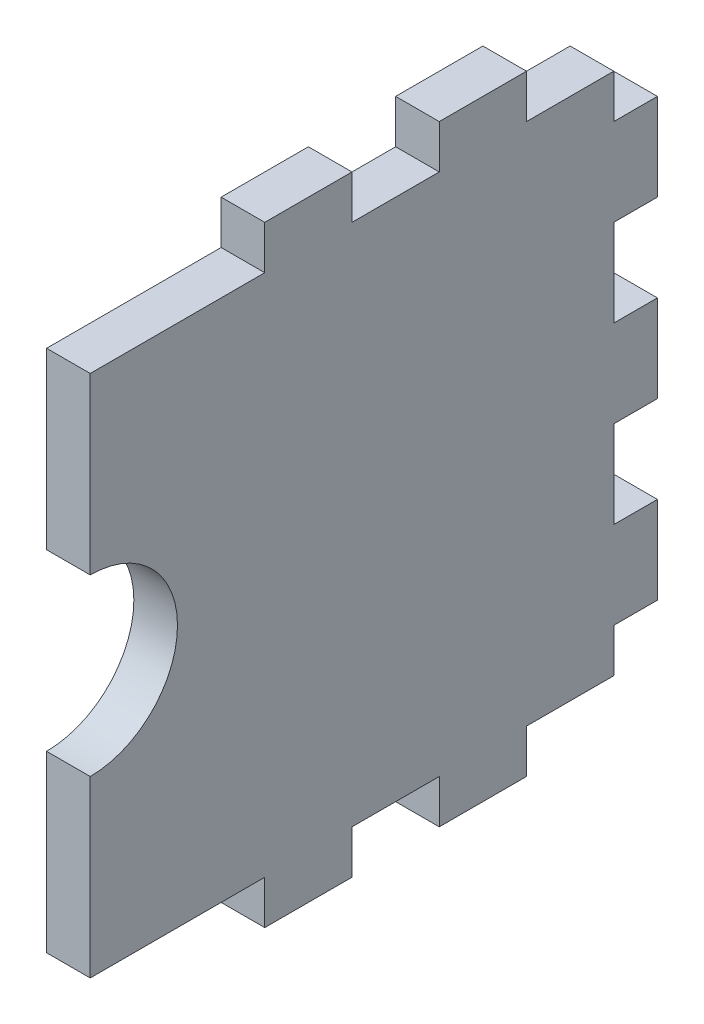
ISO-10303-21;
HEADER;
FILE_DESCRIPTION(('STEP AP214'),'2;1');
FILE_NAME('part.step','',(''),(''),'','','');
FILE_SCHEMA(('AUTOMOTIVE_DESIGN { 1 0 10303 214 1 1 1 1 }'));
ENDSEC;
DATA;
#1=APPLICATION_CONTEXT('core data for automotive mechanical design processes');
#2=APPLICATION_PROTOCOL_DEFINITION('international standard','automotive_design',2000,#1);
#3=PRODUCT_CONTEXT('',#1,'mechanical');
#4=PRODUCT('Part','Part','',(#3));
#5=PRODUCT_RELATED_PRODUCT_CATEGORY('part','',(#4));
#6=PRODUCT_DEFINITION_FORMATION('','',#4);
#7=PRODUCT_DEFINITION_CONTEXT('part definition',#1,'design');
#8=PRODUCT_DEFINITION('design','',#6,#7);
#9=PRODUCT_DEFINITION_SHAPE('','',#8);
#10=(LENGTH_UNIT() NAMED_UNIT(*) SI_UNIT(.MILLI.,.METRE.));
#11=(NAMED_UNIT(*) PLANE_ANGLE_UNIT() SI_UNIT($,.RADIAN.));
#12=(NAMED_UNIT(*) SI_UNIT($,.STERADIAN.) SOLID_ANGLE_UNIT());
#13=UNCERTAINTY_MEASURE_WITH_UNIT(LENGTH_MEASURE(1.E-05),#10,'distance_accuracy_value','');
#14=(GEOMETRIC_REPRESENTATION_CONTEXT(3) GLOBAL_UNCERTAINTY_ASSIGNED_CONTEXT((#13)) GLOBAL_UNIT_ASSIGNED_CONTEXT((#10,
#11,#12)) REPRESENTATION_CONTEXT('',''));
#15=CARTESIAN_POINT('',(0.,0.,0.));
#16=DIRECTION('',(0.,0.,1.));
#17=DIRECTION('',(1.,0.,0.));
#18=AXIS2_PLACEMENT_3D('',#15,#16,#17);
#19=CARTESIAN_POINT('',(6.35,0.,0.));
#20=DIRECTION('',(0.,1.,0.));
#21=DIRECTION('',(0.,0.,1.));
#22=AXIS2_PLACEMENT_3D('',#19,#20,#21);
#23=PLANE('',#22);
#24=DIRECTION('',(0.,0.,-1.));
#25=VECTOR('',#24,1.);
#26=CARTESIAN_POINT('',(0.,0.,0.));
#27=LINE('',#26,#25);
#28=CARTESIAN_POINT('',(0.,0.,57.15));
#29=VERTEX_POINT('',#28);
#30=CARTESIAN_POINT('',(0.,0.,44.45));
#31=VERTEX_POINT('',#30);
#32=EDGE_CURVE('E318',#29,#31,#27,.T.);
#33=ORIENTED_EDGE('',*,*,#32,.T.);
#34=DIRECTION('',(1.,0.,0.));
#35=VECTOR('',#34,1.);
#36=CARTESIAN_POINT('',(0.,0.,44.45));
#37=LINE('',#36,#35);
#38=CARTESIAN_POINT('',(6.35,0.,44.45));
#39=VERTEX_POINT('',#38);
#40=EDGE_CURVE('E388',#31,#39,#37,.T.);
#41=ORIENTED_EDGE('',*,*,#40,.T.);
#42=DIRECTION('',(0.,0.,-1.));
#43=VECTOR('',#42,1.);
#44=CARTESIAN_POINT('',(6.35,0.,0.));
#45=LINE('',#44,#43);
#46=CARTESIAN_POINT('',(6.35,0.,57.15));
#47=VERTEX_POINT('',#46);
#48=EDGE_CURVE('E566',#47,#39,#45,.T.);
#49=ORIENTED_EDGE('',*,*,#48,.F.);
#50=DIRECTION('',(1.,0.,0.));
#51=VECTOR('',#50,1.);
#52=CARTESIAN_POINT('',(0.,0.,57.15));
#53=LINE('',#52,#51);
#54=EDGE_CURVE('E496',#29,#47,#53,.T.);
#55=ORIENTED_EDGE('',*,*,#54,.F.);
#56=EDGE_LOOP('',(#33,#41,#49,#55));
#57=FACE_BOUND('',#56,.T.);
#58=ADVANCED_FACE('F45',(#57),#23,.F.);
#59=CARTESIAN_POINT('',(6.35,0.,0.));
#60=DIRECTION('',(0.,0.,1.));
#61=DIRECTION('',(1.,0.,0.));
#62=AXIS2_PLACEMENT_3D('',#59,#60,#61);
#63=PLANE('',#62);
#64=DIRECTION('',(0.,1.,0.));
#65=VECTOR('',#64,1.);
#66=CARTESIAN_POINT('',(0.,0.,0.));
#67=LINE('',#66,#65);
#68=CARTESIAN_POINT('',(0.,38.1,0.));
#69=VERTEX_POINT('',#68);
#70=CARTESIAN_POINT('',(0.,50.8,0.));
#71=VERTEX_POINT('',#70);
#72=EDGE_CURVE('E324',#69,#71,#67,.T.);
#73=ORIENTED_EDGE('',*,*,#72,.T.);
#74=DIRECTION('',(1.,0.,0.));
#75=VECTOR('',#74,1.);
#76=CARTESIAN_POINT('',(0.,50.8,0.));
#77=LINE('',#76,#75);
#78=CARTESIAN_POINT('',(6.35,50.8,0.));
#79=VERTEX_POINT('',#78);
#80=EDGE_CURVE('E458',#71,#79,#77,.T.);
#81=ORIENTED_EDGE('',*,*,#80,.T.);
#82=DIRECTION('',(0.,1.,0.));
#83=VECTOR('',#82,1.);
#84=CARTESIAN_POINT('',(6.35,0.,0.));
#85=LINE('',#84,#83);
#86=CARTESIAN_POINT('',(6.35,38.1,0.));
#87=VERTEX_POINT('',#86);
#88=EDGE_CURVE('E306',#87,#79,#85,.T.);
#89=ORIENTED_EDGE('',*,*,#88,.F.);
#90=DIRECTION('',(1.,0.,0.));
#91=VECTOR('',#90,1.);
#92=CARTESIAN_POINT('',(0.,38.1,0.));
#93=LINE('',#92,#91);
#94=EDGE_CURVE('E593',#69,#87,#93,.T.);
#95=ORIENTED_EDGE('',*,*,#94,.F.);
#96=EDGE_LOOP('',(#73,#81,#89,#95));
#97=FACE_BOUND('',#96,.T.);
#98=ADVANCED_FACE('F592',(#97),#63,.F.);
#99=CARTESIAN_POINT('',(6.35,12.7,0.));
#100=VERTEX_POINT('',#99);
#101=CARTESIAN_POINT('',(6.35,25.4,0.));
#102=VERTEX_POINT('',#101);
#103=EDGE_CURVE('E299',#100,#102,#85,.T.);
#104=ORIENTED_EDGE('',*,*,#103,.F.);
#105=DIRECTION('',(1.,0.,0.));
#106=VECTOR('',#105,1.);
#107=CARTESIAN_POINT('',(0.,12.7,0.));
#108=LINE('',#107,#106);
#109=CARTESIAN_POINT('',(0.,12.7,0.));
#110=VERTEX_POINT('',#109);
#111=EDGE_CURVE('E414',#110,#100,#108,.T.);
#112=ORIENTED_EDGE('',*,*,#111,.F.);
#113=CARTESIAN_POINT('',(0.,25.4,0.));
#114=VERTEX_POINT('',#113);
#115=EDGE_CURVE('E325',#110,#114,#67,.T.);
#116=ORIENTED_EDGE('',*,*,#115,.T.);
#117=DIRECTION('',(1.,0.,0.));
#118=VECTOR('',#117,1.);
#119=CARTESIAN_POINT('',(0.,25.4,0.));
#120=LINE('',#119,#118);
#121=EDGE_CURVE('E669',#114,#102,#120,.T.);
#122=ORIENTED_EDGE('',*,*,#121,.T.);
#123=EDGE_LOOP('',(#104,#112,#116,#122));
#124=FACE_BOUND('',#123,.T.);
#125=ADVANCED_FACE('F636',(#124),#63,.F.);
#126=CARTESIAN_POINT('',(6.35,88.9,0.));
#127=DIRECTION('',(0.,-1.,0.));
#128=DIRECTION('',(0.,0.,-1.));
#129=AXIS2_PLACEMENT_3D('',#126,#127,#128);
#130=PLANE('',#129);
#131=DIRECTION('',(0.,0.,1.));
#132=VECTOR('',#131,1.);
#133=CARTESIAN_POINT('',(0.,88.9,0.));
#134=LINE('',#133,#132);
#135=CARTESIAN_POINT('',(0.,88.9,44.45));
#136=VERTEX_POINT('',#135);
#137=CARTESIAN_POINT('',(0.,88.9,57.15));
#138=VERTEX_POINT('',#137);
#139=EDGE_CURVE('E287',#136,#138,#134,.T.);
#140=ORIENTED_EDGE('',*,*,#139,.T.);
#141=DIRECTION('',(1.,0.,0.));
#142=VECTOR('',#141,1.);
#143=CARTESIAN_POINT('',(0.,88.9,57.15));
#144=LINE('',#143,#142);
#145=CARTESIAN_POINT('',(6.35,88.9,57.15));
#146=VERTEX_POINT('',#145);
#147=EDGE_CURVE('E268',#138,#146,#144,.T.);
#148=ORIENTED_EDGE('',*,*,#147,.T.);
#149=DIRECTION('',(0.,0.,1.));
#150=VECTOR('',#149,1.);
#151=CARTESIAN_POINT('',(6.35,88.9,0.));
#152=LINE('',#151,#150);
#153=CARTESIAN_POINT('',(6.35,88.9,44.45));
#154=VERTEX_POINT('',#153);
#155=EDGE_CURVE('E285',#154,#146,#152,.T.);
#156=ORIENTED_EDGE('',*,*,#155,.F.);
#157=DIRECTION('',(1.,0.,0.));
#158=VECTOR('',#157,1.);
#159=CARTESIAN_POINT('',(0.,88.9,44.45));
#160=LINE('',#159,#158);
#161=EDGE_CURVE('E710',#136,#154,#160,.T.);
#162=ORIENTED_EDGE('',*,*,#161,.F.);
#163=EDGE_LOOP('',(#140,#148,#156,#162));
#164=FACE_BOUND('',#163,.T.);
#165=ADVANCED_FACE('F283',(#164),#130,.F.);
#166=CARTESIAN_POINT('',(6.35,0.,82.55));
#167=DIRECTION('',(0.,0.,-1.));
#168=DIRECTION('',(-1.,0.,0.));
#169=AXIS2_PLACEMENT_3D('',#166,#167,#168);
#170=PLANE('',#169);
#171=DIRECTION('',(0.,-1.,0.));
#172=VECTOR('',#171,1.);
#173=CARTESIAN_POINT('',(6.35,0.,82.55));
#174=LINE('',#173,#172);
#175=CARTESIAN_POINT('',(6.35,82.55,82.55));
#176=VERTEX_POINT('',#175);
#177=CARTESIAN_POINT('',(6.35,57.15,82.55));
#178=VERTEX_POINT('',#177);
#179=EDGE_CURVE('E54',#176,#178,#174,.T.);
#180=ORIENTED_EDGE('',*,*,#179,.F.);
#181=DIRECTION('',(1.,0.,0.));
#182=VECTOR('',#181,1.);
#183=CARTESIAN_POINT('',(0.,82.55,82.55));
#184=LINE('',#183,#182);
#185=CARTESIAN_POINT('',(0.,82.55,82.55));
#186=VERTEX_POINT('',#185);
#187=EDGE_CURVE('E728',#186,#176,#184,.T.);
#188=ORIENTED_EDGE('',*,*,#187,.F.);
#189=DIRECTION('',(0.,-1.,0.));
#190=VECTOR('',#189,1.);
#191=CARTESIAN_POINT('',(0.,0.,82.55));
#192=LINE('',#191,#190);
#193=CARTESIAN_POINT('',(0.,57.15,82.55));
#194=VERTEX_POINT('',#193);
#195=EDGE_CURVE('E331',#186,#194,#192,.T.);
#196=ORIENTED_EDGE('',*,*,#195,.T.);
#197=DIRECTION('',(1.,0.,0.));
#198=VECTOR('',#197,1.);
#199=CARTESIAN_POINT('',(0.,57.15,82.55));
#200=LINE('',#199,#198);
#201=EDGE_CURVE('E319',#194,#178,#200,.T.);
#202=ORIENTED_EDGE('',*,*,#201,.T.);
#203=EDGE_LOOP('',(#180,#188,#196,#202));
#204=FACE_BOUND('',#203,.T.);
#205=ADVANCED_FACE('F639',(#204),#170,.F.);
#206=CARTESIAN_POINT('',(0.,0.,31.75));
#207=VERTEX_POINT('',#206);
#208=CARTESIAN_POINT('',(0.,0.,19.05));
#209=VERTEX_POINT('',#208);
#210=EDGE_CURVE('E314',#207,#209,#27,.T.);
#211=ORIENTED_EDGE('',*,*,#210,.T.);
#212=DIRECTION('',(1.,0.,0.));
#213=VECTOR('',#212,1.);
#214=CARTESIAN_POINT('',(0.,0.,19.05));
#215=LINE('',#214,#213);
#216=CARTESIAN_POINT('',(6.35,0.,19.05));
#217=VERTEX_POINT('',#216);
#218=EDGE_CURVE('E427',#209,#217,#215,.T.);
#219=ORIENTED_EDGE('',*,*,#218,.T.);
#220=CARTESIAN_POINT('',(6.35,0.,31.75));
#221=VERTEX_POINT('',#220);
#222=EDGE_CURVE('E339',#221,#217,#45,.T.);
#223=ORIENTED_EDGE('',*,*,#222,.F.);
#224=DIRECTION('',(1.,0.,0.));
#225=VECTOR('',#224,1.);
#226=CARTESIAN_POINT('',(0.,0.,31.75));
#227=LINE('',#226,#225);
#228=EDGE_CURVE('E378',#207,#221,#227,.T.);
#229=ORIENTED_EDGE('',*,*,#228,.F.);
#230=EDGE_LOOP('',(#211,#219,#223,#229));
#231=FACE_BOUND('',#230,.T.);
#232=ADVANCED_FACE('F47',(#231),#23,.F.);
#233=CARTESIAN_POINT('',(6.35,63.5,0.));
#234=VERTEX_POINT('',#233);
#235=CARTESIAN_POINT('',(6.35,76.2,0.));
#236=VERTEX_POINT('',#235);
#237=EDGE_CURVE('E308',#234,#236,#85,.T.);
#238=ORIENTED_EDGE('',*,*,#237,.F.);
#239=DIRECTION('',(1.,0.,0.));
#240=VECTOR('',#239,1.);
#241=CARTESIAN_POINT('',(0.,63.5,0.));
#242=LINE('',#241,#240);
#243=CARTESIAN_POINT('',(0.,63.5,0.));
#244=VERTEX_POINT('',#243);
#245=EDGE_CURVE('E463',#244,#234,#242,.T.);
#246=ORIENTED_EDGE('',*,*,#245,.F.);
#247=CARTESIAN_POINT('',(0.,76.2,0.));
#248=VERTEX_POINT('',#247);
#249=EDGE_CURVE('E320',#244,#248,#67,.T.);
#250=ORIENTED_EDGE('',*,*,#249,.T.);
#251=DIRECTION('',(1.,0.,0.));
#252=VECTOR('',#251,1.);
#253=CARTESIAN_POINT('',(0.,76.2,0.));
#254=LINE('',#253,#252);
#255=EDGE_CURVE('E552',#248,#236,#254,.T.);
#256=ORIENTED_EDGE('',*,*,#255,.T.);
#257=EDGE_LOOP('',(#238,#246,#250,#256));
#258=FACE_BOUND('',#257,.T.);
#259=ADVANCED_FACE('F607',(#258),#63,.F.);
#260=CARTESIAN_POINT('',(0.,88.9,19.05));
#261=VERTEX_POINT('',#260);
#262=CARTESIAN_POINT('',(0.,88.9,31.75));
#263=VERTEX_POINT('',#262);
#264=EDGE_CURVE('E327',#261,#263,#134,.T.);
#265=ORIENTED_EDGE('',*,*,#264,.T.);
#266=DIRECTION('',(1.,0.,0.));
#267=VECTOR('',#266,1.);
#268=CARTESIAN_POINT('',(0.,88.9,31.75));
#269=LINE('',#268,#267);
#270=CARTESIAN_POINT('',(6.35,88.9,31.75));
#271=VERTEX_POINT('',#270);
#272=EDGE_CURVE('E347',#263,#271,#269,.T.);
#273=ORIENTED_EDGE('',*,*,#272,.T.);
#274=CARTESIAN_POINT('',(6.35,88.9,19.05));
#275=VERTEX_POINT('',#274);
#276=EDGE_CURVE('E298',#275,#271,#152,.T.);
#277=ORIENTED_EDGE('',*,*,#276,.F.);
#278=DIRECTION('',(1.,0.,0.));
#279=VECTOR('',#278,1.);
#280=CARTESIAN_POINT('',(0.,88.9,19.05));
#281=LINE('',#280,#279);
#282=EDGE_CURVE('E348',#261,#275,#281,.T.);
#283=ORIENTED_EDGE('',*,*,#282,.F.);
#284=EDGE_LOOP('',(#265,#273,#277,#283));
#285=FACE_BOUND('',#284,.T.);
#286=ADVANCED_FACE('F345',(#285),#130,.F.);
#287=CARTESIAN_POINT('',(0.,31.75,82.55));
#288=VERTEX_POINT('',#287);
#289=CARTESIAN_POINT('',(0.,6.35,82.55));
#290=VERTEX_POINT('',#289);
#291=EDGE_CURVE('E328',#288,#290,#192,.T.);
#292=ORIENTED_EDGE('',*,*,#291,.T.);
#293=DIRECTION('',(1.,0.,0.));
#294=VECTOR('',#293,1.);
#295=CARTESIAN_POINT('',(0.,6.35,82.55));
#296=LINE('',#295,#294);
#297=CARTESIAN_POINT('',(6.35,6.35,82.55));
#298=VERTEX_POINT('',#297);
#299=EDGE_CURVE('E405',#290,#298,#296,.T.);
#300=ORIENTED_EDGE('',*,*,#299,.T.);
#301=CARTESIAN_POINT('',(6.35,31.75,82.55));
#302=VERTEX_POINT('',#301);
#303=EDGE_CURVE('E304',#302,#298,#174,.T.);
#304=ORIENTED_EDGE('',*,*,#303,.F.);
#305=DIRECTION('',(1.,0.,0.));
#306=VECTOR('',#305,1.);
#307=CARTESIAN_POINT('',(0.,31.75,82.55));
#308=LINE('',#307,#306);
#309=EDGE_CURVE('E549',#302,#288,#308,.F.);
#310=ORIENTED_EDGE('',*,*,#309,.T.);
#311=EDGE_LOOP('',(#292,#300,#304,#310));
#312=FACE_BOUND('',#311,.T.);
#313=ADVANCED_FACE('F647',(#312),#170,.F.);
#314=CARTESIAN_POINT('',(6.35,0.,0.));
#315=DIRECTION('',(-1.,0.,0.));
#316=DIRECTION('',(0.,0.,1.));
#317=AXIS2_PLACEMENT_3D('',#314,#315,#316);
#318=PLANE('',#317);
#319=ORIENTED_EDGE('',*,*,#222,.T.);
#320=DIRECTION('',(0.,-1.,0.));
#321=VECTOR('',#320,1.);
#322=CARTESIAN_POINT('',(6.35,6.35,19.05));
#323=LINE('',#322,#321);
#324=CARTESIAN_POINT('',(6.35,6.35,19.05));
#325=VERTEX_POINT('',#324);
#326=EDGE_CURVE('E432',#325,#217,#323,.T.);
#327=ORIENTED_EDGE('',*,*,#326,.F.);
#328=DIRECTION('',(0.,0.,1.));
#329=VECTOR('',#328,1.);
#330=CARTESIAN_POINT('',(6.35,6.35,6.35));
#331=LINE('',#330,#329);
#332=CARTESIAN_POINT('',(6.35,6.35,6.35));
#333=VERTEX_POINT('',#332);
#334=EDGE_CURVE('E435',#333,#325,#331,.T.);
#335=ORIENTED_EDGE('',*,*,#334,.F.);
#336=DIRECTION('',(0.,-1.,0.));
#337=VECTOR('',#336,1.);
#338=CARTESIAN_POINT('',(6.35,6.35,6.35));
#339=LINE('',#338,#337);
#340=CARTESIAN_POINT('',(6.35,12.7,6.35));
#341=VERTEX_POINT('',#340);
#342=EDGE_CURVE('E440',#341,#333,#339,.T.);
#343=ORIENTED_EDGE('',*,*,#342,.F.);
#344=DIRECTION('',(0.,0.,1.));
#345=VECTOR('',#344,1.);
#346=CARTESIAN_POINT('',(6.35,12.7,0.));
#347=LINE('',#346,#345);
#348=EDGE_CURVE('E392',#100,#341,#347,.T.);
#349=ORIENTED_EDGE('',*,*,#348,.F.);
#350=ORIENTED_EDGE('',*,*,#103,.T.);
#351=DIRECTION('',(0.,0.,-1.));
#352=VECTOR('',#351,1.);
#353=CARTESIAN_POINT('',(6.35,25.4,0.));
#354=LINE('',#353,#352);
#355=CARTESIAN_POINT('',(6.35,25.4,6.35));
#356=VERTEX_POINT('',#355);
#357=EDGE_CURVE('E289',#356,#102,#354,.T.);
#358=ORIENTED_EDGE('',*,*,#357,.F.);
#359=DIRECTION('',(0.,-1.,0.));
#360=VECTOR('',#359,1.);
#361=CARTESIAN_POINT('',(6.35,25.4,6.35));
#362=LINE('',#361,#360);
#363=CARTESIAN_POINT('',(6.35,38.1,6.35));
#364=VERTEX_POINT('',#363);
#365=EDGE_CURVE('E691',#364,#356,#362,.T.);
#366=ORIENTED_EDGE('',*,*,#365,.F.);
#367=DIRECTION('',(0.,0.,1.));
#368=VECTOR('',#367,1.);
#369=CARTESIAN_POINT('',(6.35,38.1,0.));
#370=LINE('',#369,#368);
#371=EDGE_CURVE('E588',#87,#364,#370,.T.);
#372=ORIENTED_EDGE('',*,*,#371,.F.);
#373=ORIENTED_EDGE('',*,*,#88,.T.);
#374=DIRECTION('',(0.,0.,-1.));
#375=VECTOR('',#374,1.);
#376=CARTESIAN_POINT('',(6.35,50.8,0.));
#377=LINE('',#376,#375);
#378=CARTESIAN_POINT('',(6.35,50.8,6.35));
#379=VERTEX_POINT('',#378);
#380=EDGE_CURVE('E482',#379,#79,#377,.T.);
#381=ORIENTED_EDGE('',*,*,#380,.F.);
#382=DIRECTION('',(0.,-1.,0.));
#383=VECTOR('',#382,1.);
#384=CARTESIAN_POINT('',(6.35,50.8,6.35));
#385=LINE('',#384,#383);
#386=CARTESIAN_POINT('',(6.35,63.5,6.35));
#387=VERTEX_POINT('',#386);
#388=EDGE_CURVE('E473',#387,#379,#385,.T.);
#389=ORIENTED_EDGE('',*,*,#388,.F.);
#390=DIRECTION('',(0.,0.,1.));
#391=VECTOR('',#390,1.);
#392=CARTESIAN_POINT('',(6.35,63.5,0.));
#393=LINE('',#392,#391);
#394=EDGE_CURVE('E477',#234,#387,#393,.T.);
#395=ORIENTED_EDGE('',*,*,#394,.F.);
#396=ORIENTED_EDGE('',*,*,#237,.T.);
#397=DIRECTION('',(0.,0.,-1.));
#398=VECTOR('',#397,1.);
#399=CARTESIAN_POINT('',(6.35,76.2,0.));
#400=LINE('',#399,#398);
#401=CARTESIAN_POINT('',(6.35,76.2,6.35000000000001));
#402=VERTEX_POINT('',#401);
#403=EDGE_CURVE('E540',#402,#236,#400,.T.);
#404=ORIENTED_EDGE('',*,*,#403,.F.);
#405=DIRECTION('',(0.,-1.,0.));
#406=VECTOR('',#405,1.);
#407=CARTESIAN_POINT('',(6.35,76.2,6.35000000000001));
#408=LINE('',#407,#406);
#409=CARTESIAN_POINT('',(6.35,82.55,6.35000000000001));
#410=VERTEX_POINT('',#409);
#411=EDGE_CURVE('E536',#410,#402,#408,.T.);
#412=ORIENTED_EDGE('',*,*,#411,.F.);
#413=DIRECTION('',(0.,0.,-1.));
#414=VECTOR('',#413,1.);
#415=CARTESIAN_POINT('',(6.35,82.55,6.35000000000001));
#416=LINE('',#415,#414);
#417=CARTESIAN_POINT('',(6.35,82.55,19.05));
#418=VERTEX_POINT('',#417);
#419=EDGE_CURVE('E485',#418,#410,#416,.T.);
#420=ORIENTED_EDGE('',*,*,#419,.F.);
#421=DIRECTION('',(0.,-1.,0.));
#422=VECTOR('',#421,1.);
#423=CARTESIAN_POINT('',(6.35,88.9,19.05));
#424=LINE('',#423,#422);
#425=EDGE_CURVE('E522',#275,#418,#424,.T.);
#426=ORIENTED_EDGE('',*,*,#425,.F.);
#427=ORIENTED_EDGE('',*,*,#276,.T.);
#428=DIRECTION('',(0.,1.,0.));
#429=VECTOR('',#428,1.);
#430=CARTESIAN_POINT('',(6.35,88.9,31.75));
#431=LINE('',#430,#429);
#432=CARTESIAN_POINT('',(6.35,82.55,31.75));
#433=VERTEX_POINT('',#432);
#434=EDGE_CURVE('E377',#433,#271,#431,.T.);
#435=ORIENTED_EDGE('',*,*,#434,.F.);
#436=DIRECTION('',(0.,0.,-1.));
#437=VECTOR('',#436,1.);
#438=CARTESIAN_POINT('',(6.35,82.55,44.45));
#439=LINE('',#438,#437);
#440=CARTESIAN_POINT('',(6.35,82.55,44.45));
#441=VERTEX_POINT('',#440);
#442=EDGE_CURVE('E714',#441,#433,#439,.T.);
#443=ORIENTED_EDGE('',*,*,#442,.F.);
#444=DIRECTION('',(0.,-1.,0.));
#445=VECTOR('',#444,1.);
#446=CARTESIAN_POINT('',(6.35,88.9,44.45));
#447=LINE('',#446,#445);
#448=EDGE_CURVE('E296',#154,#441,#447,.T.);
#449=ORIENTED_EDGE('',*,*,#448,.F.);
#450=ORIENTED_EDGE('',*,*,#155,.T.);
#451=DIRECTION('',(0.,1.,0.));
#452=VECTOR('',#451,1.);
#453=CARTESIAN_POINT('',(6.35,88.9,57.15));
#454=LINE('',#453,#452);
#455=CARTESIAN_POINT('',(6.35,82.55,57.15));
#456=VERTEX_POINT('',#455);
#457=EDGE_CURVE('E265',#456,#146,#454,.T.);
#458=ORIENTED_EDGE('',*,*,#457,.F.);
#459=DIRECTION('',(0.,0.,-1.));
#460=VECTOR('',#459,1.);
#461=CARTESIAN_POINT('',(6.35,82.55,82.55));
#462=LINE('',#461,#460);
#463=EDGE_CURVE('E277',#176,#456,#462,.T.);
#464=ORIENTED_EDGE('',*,*,#463,.F.);
#465=ORIENTED_EDGE('',*,*,#179,.T.);
#466=CARTESIAN_POINT('',(6.35,44.45,82.55));
#467=DIRECTION('',(1.,0.,0.));
#468=DIRECTION('',(0.,0.,-1.));
#469=AXIS2_PLACEMENT_3D('',#466,#467,#468);
#470=CIRCLE('',#469,12.7);
#471=EDGE_CURVE('E431',#302,#178,#470,.T.);
#472=ORIENTED_EDGE('',*,*,#471,.F.);
#473=ORIENTED_EDGE('',*,*,#303,.T.);
#474=DIRECTION('',(0.,0.,1.));
#475=VECTOR('',#474,1.);
#476=CARTESIAN_POINT('',(6.35,6.35,82.55));
#477=LINE('',#476,#475);
#478=CARTESIAN_POINT('',(6.35,6.35,57.15));
#479=VERTEX_POINT('',#478);
#480=EDGE_CURVE('E505',#479,#298,#477,.T.);
#481=ORIENTED_EDGE('',*,*,#480,.F.);
#482=DIRECTION('',(0.,1.,0.));
#483=VECTOR('',#482,1.);
#484=CARTESIAN_POINT('',(6.35,0.,57.15));
#485=LINE('',#484,#483);
#486=EDGE_CURVE('E472',#47,#479,#485,.T.);
#487=ORIENTED_EDGE('',*,*,#486,.F.);
#488=ORIENTED_EDGE('',*,*,#48,.T.);
#489=DIRECTION('',(0.,-1.,0.));
#490=VECTOR('',#489,1.);
#491=CARTESIAN_POINT('',(6.35,0.,44.45));
#492=LINE('',#491,#490);
#493=CARTESIAN_POINT('',(6.35,6.35,44.45));
#494=VERTEX_POINT('',#493);
#495=EDGE_CURVE('E393',#494,#39,#492,.T.);
#496=ORIENTED_EDGE('',*,*,#495,.F.);
#497=DIRECTION('',(0.,0.,1.));
#498=VECTOR('',#497,1.);
#499=CARTESIAN_POINT('',(6.35,6.35,44.45));
#500=LINE('',#499,#498);
#501=CARTESIAN_POINT('',(6.35,6.35,31.75));
#502=VERTEX_POINT('',#501);
#503=EDGE_CURVE('E396',#502,#494,#500,.T.);
#504=ORIENTED_EDGE('',*,*,#503,.F.);
#505=DIRECTION('',(0.,1.,0.));
#506=VECTOR('',#505,1.);
#507=CARTESIAN_POINT('',(6.35,0.,31.75));
#508=LINE('',#507,#506);
#509=EDGE_CURVE('E401',#221,#502,#508,.T.);
#510=ORIENTED_EDGE('',*,*,#509,.F.);
#511=EDGE_LOOP('',(#319,#327,#335,#343,#349,#350,#358,#366,#372,#373,#381,#389,#395,#396,#404,
#412,#420,#426,#427,#435,#443,#449,#450,#458,#464,#465,#472,#473,#481,#487,#488,#496,#504,#510));
#512=FACE_BOUND('',#511,.T.);
#513=ADVANCED_FACE('F293',(#512),#318,.F.);
#514=CARTESIAN_POINT('',(0.,0.,0.));
#515=DIRECTION('',(-1.,0.,0.));
#516=DIRECTION('',(0.,0.,1.));
#517=AXIS2_PLACEMENT_3D('',#514,#515,#516);
#518=PLANE('',#517);
#519=DIRECTION('',(0.,-1.,0.));
#520=VECTOR('',#519,1.);
#521=CARTESIAN_POINT('',(0.,6.35,19.05));
#522=LINE('',#521,#520);
#523=CARTESIAN_POINT('',(0.,6.35,19.05));
#524=VERTEX_POINT('',#523);
#525=EDGE_CURVE('E417',#524,#209,#522,.T.);
#526=ORIENTED_EDGE('',*,*,#525,.T.);
#527=ORIENTED_EDGE('',*,*,#210,.F.);
#528=DIRECTION('',(0.,1.,0.));
#529=VECTOR('',#528,1.);
#530=CARTESIAN_POINT('',(0.,0.,31.75));
#531=LINE('',#530,#529);
#532=CARTESIAN_POINT('',(0.,6.35,31.75));
#533=VERTEX_POINT('',#532);
#534=EDGE_CURVE('E397',#207,#533,#531,.T.);
#535=ORIENTED_EDGE('',*,*,#534,.T.);
#536=DIRECTION('',(0.,0.,1.));
#537=VECTOR('',#536,1.);
#538=CARTESIAN_POINT('',(0.,6.35,44.45));
#539=LINE('',#538,#537);
#540=CARTESIAN_POINT('',(0.,6.35,44.45));
#541=VERTEX_POINT('',#540);
#542=EDGE_CURVE('E69',#533,#541,#539,.T.);
#543=ORIENTED_EDGE('',*,*,#542,.T.);
#544=DIRECTION('',(0.,-1.,0.));
#545=VECTOR('',#544,1.);
#546=CARTESIAN_POINT('',(0.,0.,44.45));
#547=LINE('',#546,#545);
#548=EDGE_CURVE('E381',#541,#31,#547,.T.);
#549=ORIENTED_EDGE('',*,*,#548,.T.);
#550=ORIENTED_EDGE('',*,*,#32,.F.);
#551=DIRECTION('',(0.,1.,0.));
#552=VECTOR('',#551,1.);
#553=CARTESIAN_POINT('',(0.,0.,57.15));
#554=LINE('',#553,#552);
#555=CARTESIAN_POINT('',(0.,6.35,57.15));
#556=VERTEX_POINT('',#555);
#557=EDGE_CURVE('E508',#29,#556,#554,.T.);
#558=ORIENTED_EDGE('',*,*,#557,.T.);
#559=DIRECTION('',(0.,0.,1.));
#560=VECTOR('',#559,1.);
#561=CARTESIAN_POINT('',(0.,6.35,82.55));
#562=LINE('',#561,#560);
#563=EDGE_CURVE('E499',#556,#290,#562,.T.);
#564=ORIENTED_EDGE('',*,*,#563,.T.);
#565=ORIENTED_EDGE('',*,*,#291,.F.);
#566=CARTESIAN_POINT('',(0.,44.45,82.55));
#567=DIRECTION('',(-1.,0.,0.));
#568=DIRECTION('',(0.,0.,1.));
#569=AXIS2_PLACEMENT_3D('',#566,#567,#568);
#570=CIRCLE('',#569,12.7);
#571=EDGE_CURVE('E11',#194,#288,#570,.T.);
#572=ORIENTED_EDGE('',*,*,#571,.F.);
#573=ORIENTED_EDGE('',*,*,#195,.F.);
#574=DIRECTION('',(0.,0.,-1.));
#575=VECTOR('',#574,1.);
#576=CARTESIAN_POINT('',(0.,82.55,82.55));
#577=LINE('',#576,#575);
#578=CARTESIAN_POINT('',(0.,82.55,57.15));
#579=VERTEX_POINT('',#578);
#580=EDGE_CURVE('E278',#186,#579,#577,.T.);
#581=ORIENTED_EDGE('',*,*,#580,.T.);
#582=DIRECTION('',(0.,1.,0.));
#583=VECTOR('',#582,1.);
#584=CARTESIAN_POINT('',(0.,88.9,57.15));
#585=LINE('',#584,#583);
#586=EDGE_CURVE('E725',#579,#138,#585,.T.);
#587=ORIENTED_EDGE('',*,*,#586,.T.);
#588=ORIENTED_EDGE('',*,*,#139,.F.);
#589=DIRECTION('',(0.,-1.,0.));
#590=VECTOR('',#589,1.);
#591=CARTESIAN_POINT('',(0.,88.9,44.45));
#592=LINE('',#591,#590);
#593=CARTESIAN_POINT('',(0.,82.55,44.45));
#594=VERTEX_POINT('',#593);
#595=EDGE_CURVE('E368',#136,#594,#592,.T.);
#596=ORIENTED_EDGE('',*,*,#595,.T.);
#597=DIRECTION('',(0.,0.,-1.));
#598=VECTOR('',#597,1.);
#599=CARTESIAN_POINT('',(0.,82.55,44.45));
#600=LINE('',#599,#598);
#601=CARTESIAN_POINT('',(0.,82.55,31.75));
#602=VERTEX_POINT('',#601);
#603=EDGE_CURVE('E360',#594,#602,#600,.T.);
#604=ORIENTED_EDGE('',*,*,#603,.T.);
#605=DIRECTION('',(0.,1.,0.));
#606=VECTOR('',#605,1.);
#607=CARTESIAN_POINT('',(0.,88.9,31.75));
#608=LINE('',#607,#606);
#609=EDGE_CURVE('E357',#602,#263,#608,.T.);
#610=ORIENTED_EDGE('',*,*,#609,.T.);
#611=ORIENTED_EDGE('',*,*,#264,.F.);
#612=DIRECTION('',(0.,-1.,0.));
#613=VECTOR('',#612,1.);
#614=CARTESIAN_POINT('',(0.,88.9,19.05));
#615=LINE('',#614,#613);
#616=CARTESIAN_POINT('',(0.,82.55,19.05));
#617=VERTEX_POINT('',#616);
#618=EDGE_CURVE('E355',#261,#617,#615,.T.);
#619=ORIENTED_EDGE('',*,*,#618,.T.);
#620=DIRECTION('',(0.,0.,-1.));
#621=VECTOR('',#620,1.);
#622=CARTESIAN_POINT('',(0.,82.55,6.35000000000001));
#623=LINE('',#622,#621);
#624=CARTESIAN_POINT('',(0.,82.55,6.35000000000001));
#625=VERTEX_POINT('',#624);
#626=EDGE_CURVE('E518',#617,#625,#623,.T.);
#627=ORIENTED_EDGE('',*,*,#626,.T.);
#628=DIRECTION('',(0.,-1.,0.));
#629=VECTOR('',#628,1.);
#630=CARTESIAN_POINT('',(0.,76.2,6.35000000000001));
#631=LINE('',#630,#629);
#632=CARTESIAN_POINT('',(0.,76.2,6.35000000000001));
#633=VERTEX_POINT('',#632);
#634=EDGE_CURVE('E521',#625,#633,#631,.T.);
#635=ORIENTED_EDGE('',*,*,#634,.T.);
#636=DIRECTION('',(0.,0.,-1.));
#637=VECTOR('',#636,1.);
#638=CARTESIAN_POINT('',(0.,76.2,0.));
#639=LINE('',#638,#637);
#640=EDGE_CURVE('E526',#633,#248,#639,.T.);
#641=ORIENTED_EDGE('',*,*,#640,.T.);
#642=ORIENTED_EDGE('',*,*,#249,.F.);
#643=DIRECTION('',(0.,0.,1.));
#644=VECTOR('',#643,1.);
#645=CARTESIAN_POINT('',(0.,63.5,0.));
#646=LINE('',#645,#644);
#647=CARTESIAN_POINT('',(0.,63.5,6.35));
#648=VERTEX_POINT('',#647);
#649=EDGE_CURVE('E489',#244,#648,#646,.T.);
#650=ORIENTED_EDGE('',*,*,#649,.T.);
#651=DIRECTION('',(0.,-1.,0.));
#652=VECTOR('',#651,1.);
#653=CARTESIAN_POINT('',(0.,50.8,6.35));
#654=LINE('',#653,#652);
#655=CARTESIAN_POINT('',(0.,50.8,6.35));
#656=VERTEX_POINT('',#655);
#657=EDGE_CURVE('E462',#648,#656,#654,.T.);
#658=ORIENTED_EDGE('',*,*,#657,.T.);
#659=DIRECTION('',(0.,0.,-1.));
#660=VECTOR('',#659,1.);
#661=CARTESIAN_POINT('',(0.,50.8,0.));
#662=LINE('',#661,#660);
#663=EDGE_CURVE('E478',#656,#71,#662,.T.);
#664=ORIENTED_EDGE('',*,*,#663,.T.);
#665=ORIENTED_EDGE('',*,*,#72,.F.);
#666=DIRECTION('',(0.,0.,1.));
#667=VECTOR('',#666,1.);
#668=CARTESIAN_POINT('',(0.,38.1,0.));
#669=LINE('',#668,#667);
#670=CARTESIAN_POINT('',(0.,38.1,6.35));
#671=VERTEX_POINT('',#670);
#672=EDGE_CURVE('E679',#69,#671,#669,.T.);
#673=ORIENTED_EDGE('',*,*,#672,.T.);
#674=DIRECTION('',(0.,-1.,0.));
#675=VECTOR('',#674,1.);
#676=CARTESIAN_POINT('',(0.,25.4,6.35));
#677=LINE('',#676,#675);
#678=CARTESIAN_POINT('',(0.,25.4,6.35));
#679=VERTEX_POINT('',#678);
#680=EDGE_CURVE('E674',#671,#679,#677,.T.);
#681=ORIENTED_EDGE('',*,*,#680,.T.);
#682=DIRECTION('',(0.,0.,-1.));
#683=VECTOR('',#682,1.);
#684=CARTESIAN_POINT('',(0.,25.4,0.));
#685=LINE('',#684,#683);
#686=EDGE_CURVE('E695',#679,#114,#685,.T.);
#687=ORIENTED_EDGE('',*,*,#686,.T.);
#688=ORIENTED_EDGE('',*,*,#115,.F.);
#689=DIRECTION('',(0.,0.,1.));
#690=VECTOR('',#689,1.);
#691=CARTESIAN_POINT('',(0.,12.7,0.));
#692=LINE('',#691,#690);
#693=CARTESIAN_POINT('',(0.,12.7,6.35));
#694=VERTEX_POINT('',#693);
#695=EDGE_CURVE('E436',#110,#694,#692,.T.);
#696=ORIENTED_EDGE('',*,*,#695,.T.);
#697=DIRECTION('',(0.,-1.,0.));
#698=VECTOR('',#697,1.);
#699=CARTESIAN_POINT('',(0.,6.35,6.35));
#700=LINE('',#699,#698);
#701=CARTESIAN_POINT('',(0.,6.35,6.35));
#702=VERTEX_POINT('',#701);
#703=EDGE_CURVE('E61',#694,#702,#700,.T.);
#704=ORIENTED_EDGE('',*,*,#703,.T.);
#705=DIRECTION('',(0.,0.,1.));
#706=VECTOR('',#705,1.);
#707=CARTESIAN_POINT('',(0.,6.35,6.35));
#708=LINE('',#707,#706);
#709=EDGE_CURVE('E449',#702,#524,#708,.T.);
#710=ORIENTED_EDGE('',*,*,#709,.T.);
#711=EDGE_LOOP('',(#526,#527,#535,#543,#549,#550,#558,#564,#565,#572,#573,#581,#587,#588,#596,
#604,#610,#611,#619,#627,#635,#641,#642,#650,#658,#664,#665,#673,#681,#687,#688,#696,#704,#710));
#712=FACE_BOUND('',#711,.T.);
#713=ADVANCED_FACE('F353',(#712),#518,.T.);
#714=CARTESIAN_POINT('',(0.,82.55,6.35000000000001));
#715=DIRECTION('',(0.,-1.,0.));
#716=DIRECTION('',(0.,0.,-1.));
#717=AXIS2_PLACEMENT_3D('',#714,#715,#716);
#718=PLANE('',#717);
#719=ORIENTED_EDGE('',*,*,#419,.T.);
#720=DIRECTION('',(1.,0.,0.));
#721=VECTOR('',#720,1.);
#722=CARTESIAN_POINT('',(0.,82.55,6.35000000000001));
#723=LINE('',#722,#721);
#724=EDGE_CURVE('E532',#625,#410,#723,.T.);
#725=ORIENTED_EDGE('',*,*,#724,.F.);
#726=ORIENTED_EDGE('',*,*,#626,.F.);
#727=DIRECTION('',(1.,0.,0.));
#728=VECTOR('',#727,1.);
#729=CARTESIAN_POINT('',(0.,82.55,19.05));
#730=LINE('',#729,#728);
#731=EDGE_CURVE('E546',#617,#418,#730,.T.);
#732=ORIENTED_EDGE('',*,*,#731,.T.);
#733=EDGE_LOOP('',(#719,#725,#726,#732));
#734=FACE_BOUND('',#733,.T.);
#735=ADVANCED_FACE('F619',(#734),#718,.F.);
#736=CARTESIAN_POINT('',(0.,88.9,19.05));
#737=DIRECTION('',(0.,0.,1.));
#738=DIRECTION('',(1.,0.,0.));
#739=AXIS2_PLACEMENT_3D('',#736,#737,#738);
#740=PLANE('',#739);
#741=ORIENTED_EDGE('',*,*,#425,.T.);
#742=ORIENTED_EDGE('',*,*,#731,.F.);
#743=ORIENTED_EDGE('',*,*,#618,.F.);
#744=ORIENTED_EDGE('',*,*,#282,.T.);
#745=EDGE_LOOP('',(#741,#742,#743,#744));
#746=FACE_BOUND('',#745,.T.);
#747=ADVANCED_FACE('F621',(#746),#740,.F.);
#748=CARTESIAN_POINT('',(0.,76.2,0.));
#749=DIRECTION('',(0.,-1.,0.));
#750=DIRECTION('',(0.,0.,-1.));
#751=AXIS2_PLACEMENT_3D('',#748,#749,#750);
#752=PLANE('',#751);
#753=ORIENTED_EDGE('',*,*,#403,.T.);
#754=ORIENTED_EDGE('',*,*,#255,.F.);
#755=ORIENTED_EDGE('',*,*,#640,.F.);
#756=DIRECTION('',(1.,0.,0.));
#757=VECTOR('',#756,1.);
#758=CARTESIAN_POINT('',(0.,76.2,6.35000000000001));
#759=LINE('',#758,#757);
#760=EDGE_CURVE('E556',#633,#402,#759,.T.);
#761=ORIENTED_EDGE('',*,*,#760,.T.);
#762=EDGE_LOOP('',(#753,#754,#755,#761));
#763=FACE_BOUND('',#762,.T.);
#764=ADVANCED_FACE('F609',(#763),#752,.F.);
#765=CARTESIAN_POINT('',(0.,76.2,6.35000000000001));
#766=DIRECTION('',(0.,0.,1.));
#767=DIRECTION('',(1.,0.,0.));
#768=AXIS2_PLACEMENT_3D('',#765,#766,#767);
#769=PLANE('',#768);
#770=ORIENTED_EDGE('',*,*,#411,.T.);
#771=ORIENTED_EDGE('',*,*,#760,.F.);
#772=ORIENTED_EDGE('',*,*,#634,.F.);
#773=ORIENTED_EDGE('',*,*,#724,.T.);
#774=EDGE_LOOP('',(#770,#771,#772,#773));
#775=FACE_BOUND('',#774,.T.);
#776=ADVANCED_FACE('F614',(#775),#769,.F.);
#777=CARTESIAN_POINT('',(0.,44.45,82.55));
#778=DIRECTION('',(1.,0.,0.));
#779=DIRECTION('',(0.,0.,-1.));
#780=AXIS2_PLACEMENT_3D('',#777,#778,#779);
#781=CYLINDRICAL_SURFACE('',#780,12.7);
#782=ORIENTED_EDGE('',*,*,#571,.T.);
#783=ORIENTED_EDGE('',*,*,#309,.F.);
#784=ORIENTED_EDGE('',*,*,#471,.T.);
#785=ORIENTED_EDGE('',*,*,#201,.F.);
#786=EDGE_LOOP('',(#782,#783,#784,#785));
#787=FACE_BOUND('',#786,.T.);
#788=ADVANCED_FACE('F745',(#787),#781,.F.);
#789=CARTESIAN_POINT('',(0.,88.9,44.45));
#790=DIRECTION('',(0.,0.,1.));
#791=DIRECTION('',(1.,0.,0.));
#792=AXIS2_PLACEMENT_3D('',#789,#790,#791);
#793=PLANE('',#792);
#794=ORIENTED_EDGE('',*,*,#448,.T.);
#795=DIRECTION('',(1.,0.,0.));
#796=VECTOR('',#795,1.);
#797=CARTESIAN_POINT('',(0.,82.55,44.45));
#798=LINE('',#797,#796);
#799=EDGE_CURVE('E364',#594,#441,#798,.T.);
#800=ORIENTED_EDGE('',*,*,#799,.F.);
#801=ORIENTED_EDGE('',*,*,#595,.F.);
#802=ORIENTED_EDGE('',*,*,#161,.T.);
#803=EDGE_LOOP('',(#794,#800,#801,#802));
#804=FACE_BOUND('',#803,.T.);
#805=ADVANCED_FACE('F721',(#804),#793,.F.);
#806=CARTESIAN_POINT('',(0.,88.9,31.75));
#807=DIRECTION('',(0.,0.,-1.));
#808=DIRECTION('',(-1.,0.,0.));
#809=AXIS2_PLACEMENT_3D('',#806,#807,#808);
#810=PLANE('',#809);
#811=ORIENTED_EDGE('',*,*,#434,.T.);
#812=ORIENTED_EDGE('',*,*,#272,.F.);
#813=ORIENTED_EDGE('',*,*,#609,.F.);
#814=DIRECTION('',(1.,0.,0.));
#815=VECTOR('',#814,1.);
#816=CARTESIAN_POINT('',(0.,82.55,31.75));
#817=LINE('',#816,#815);
#818=EDGE_CURVE('E370',#602,#433,#817,.T.);
#819=ORIENTED_EDGE('',*,*,#818,.T.);
#820=EDGE_LOOP('',(#811,#812,#813,#819));
#821=FACE_BOUND('',#820,.T.);
#822=ADVANCED_FACE('F722',(#821),#810,.F.);
#823=CARTESIAN_POINT('',(0.,82.55,44.45));
#824=DIRECTION('',(0.,-1.,0.));
#825=DIRECTION('',(0.,0.,-1.));
#826=AXIS2_PLACEMENT_3D('',#823,#824,#825);
#827=PLANE('',#826);
#828=ORIENTED_EDGE('',*,*,#442,.T.);
#829=ORIENTED_EDGE('',*,*,#818,.F.);
#830=ORIENTED_EDGE('',*,*,#603,.F.);
#831=ORIENTED_EDGE('',*,*,#799,.T.);
#832=EDGE_LOOP('',(#828,#829,#830,#831));
#833=FACE_BOUND('',#832,.T.);
#834=ADVANCED_FACE('F723',(#833),#827,.F.);
#835=CARTESIAN_POINT('',(0.,88.9,57.15));
#836=DIRECTION('',(0.,0.,-1.));
#837=DIRECTION('',(-1.,0.,0.));
#838=AXIS2_PLACEMENT_3D('',#835,#836,#837);
#839=PLANE('',#838);
#840=ORIENTED_EDGE('',*,*,#457,.T.);
#841=ORIENTED_EDGE('',*,*,#147,.F.);
#842=ORIENTED_EDGE('',*,*,#586,.F.);
#843=DIRECTION('',(1.,0.,0.));
#844=VECTOR('',#843,1.);
#845=CARTESIAN_POINT('',(0.,82.55,57.15));
#846=LINE('',#845,#844);
#847=EDGE_CURVE('E271',#579,#456,#846,.T.);
#848=ORIENTED_EDGE('',*,*,#847,.T.);
#849=EDGE_LOOP('',(#840,#841,#842,#848));
#850=FACE_BOUND('',#849,.T.);
#851=ADVANCED_FACE('F267',(#850),#839,.F.);
#852=CARTESIAN_POINT('',(0.,82.55,82.55));
#853=DIRECTION('',(0.,-1.,0.));
#854=DIRECTION('',(0.,0.,-1.));
#855=AXIS2_PLACEMENT_3D('',#852,#853,#854);
#856=PLANE('',#855);
#857=ORIENTED_EDGE('',*,*,#463,.T.);
#858=ORIENTED_EDGE('',*,*,#847,.F.);
#859=ORIENTED_EDGE('',*,*,#580,.F.);
#860=ORIENTED_EDGE('',*,*,#187,.T.);
#861=EDGE_LOOP('',(#857,#858,#859,#860));
#862=FACE_BOUND('',#861,.T.);
#863=ADVANCED_FACE('F737',(#862),#856,.F.);
#864=CARTESIAN_POINT('',(0.,25.4,0.));
#865=DIRECTION('',(0.,-1.,0.));
#866=DIRECTION('',(0.,0.,-1.));
#867=AXIS2_PLACEMENT_3D('',#864,#865,#866);
#868=PLANE('',#867);
#869=ORIENTED_EDGE('',*,*,#357,.T.);
#870=ORIENTED_EDGE('',*,*,#121,.F.);
#871=ORIENTED_EDGE('',*,*,#686,.F.);
#872=DIRECTION('',(1.,0.,0.));
#873=VECTOR('',#872,1.);
#874=CARTESIAN_POINT('',(0.,25.4,6.35));
#875=LINE('',#874,#873);
#876=EDGE_CURVE('E688',#679,#356,#875,.T.);
#877=ORIENTED_EDGE('',*,*,#876,.T.);
#878=EDGE_LOOP('',(#869,#870,#871,#877));
#879=FACE_BOUND('',#878,.T.);
#880=ADVANCED_FACE('F892',(#879),#868,.F.);
#881=CARTESIAN_POINT('',(0.,25.4,6.35));
#882=DIRECTION('',(0.,0.,1.));
#883=DIRECTION('',(1.,0.,0.));
#884=AXIS2_PLACEMENT_3D('',#881,#882,#883);
#885=PLANE('',#884);
#886=ORIENTED_EDGE('',*,*,#365,.T.);
#887=ORIENTED_EDGE('',*,*,#876,.F.);
#888=ORIENTED_EDGE('',*,*,#680,.F.);
#889=DIRECTION('',(1.,0.,0.));
#890=VECTOR('',#889,1.);
#891=CARTESIAN_POINT('',(0.,38.1,6.35));
#892=LINE('',#891,#890);
#893=EDGE_CURVE('E681',#671,#364,#892,.T.);
#894=ORIENTED_EDGE('',*,*,#893,.T.);
#895=EDGE_LOOP('',(#886,#887,#888,#894));
#896=FACE_BOUND('',#895,.T.);
#897=ADVANCED_FACE('F775',(#896),#885,.F.);
#898=CARTESIAN_POINT('',(0.,38.1,0.));
#899=DIRECTION('',(0.,1.,0.));
#900=DIRECTION('',(0.,0.,1.));
#901=AXIS2_PLACEMENT_3D('',#898,#899,#900);
#902=PLANE('',#901);
#903=ORIENTED_EDGE('',*,*,#371,.T.);
#904=ORIENTED_EDGE('',*,*,#893,.F.);
#905=ORIENTED_EDGE('',*,*,#672,.F.);
#906=ORIENTED_EDGE('',*,*,#94,.T.);
#907=EDGE_LOOP('',(#903,#904,#905,#906));
#908=FACE_BOUND('',#907,.T.);
#909=ADVANCED_FACE('F803',(#908),#902,.F.);
#910=CARTESIAN_POINT('',(0.,50.8,0.));
#911=DIRECTION('',(0.,-1.,0.));
#912=DIRECTION('',(0.,0.,-1.));
#913=AXIS2_PLACEMENT_3D('',#910,#911,#912);
#914=PLANE('',#913);
#915=ORIENTED_EDGE('',*,*,#380,.T.);
#916=ORIENTED_EDGE('',*,*,#80,.F.);
#917=ORIENTED_EDGE('',*,*,#663,.F.);
#918=DIRECTION('',(1.,0.,0.));
#919=VECTOR('',#918,1.);
#920=CARTESIAN_POINT('',(0.,50.8,6.35));
#921=LINE('',#920,#919);
#922=EDGE_CURVE('E469',#656,#379,#921,.T.);
#923=ORIENTED_EDGE('',*,*,#922,.T.);
#924=EDGE_LOOP('',(#915,#916,#917,#923));
#925=FACE_BOUND('',#924,.T.);
#926=ADVANCED_FACE('F597',(#925),#914,.F.);
#927=CARTESIAN_POINT('',(0.,50.8,6.35));
#928=DIRECTION('',(0.,0.,1.));
#929=DIRECTION('',(1.,0.,0.));
#930=AXIS2_PLACEMENT_3D('',#927,#928,#929);
#931=PLANE('',#930);
#932=ORIENTED_EDGE('',*,*,#388,.T.);
#933=ORIENTED_EDGE('',*,*,#922,.F.);
#934=ORIENTED_EDGE('',*,*,#657,.F.);
#935=DIRECTION('',(1.,0.,0.));
#936=VECTOR('',#935,1.);
#937=CARTESIAN_POINT('',(0.,63.5,6.35));
#938=LINE('',#937,#936);
#939=EDGE_CURVE('E466',#648,#387,#938,.T.);
#940=ORIENTED_EDGE('',*,*,#939,.T.);
#941=EDGE_LOOP('',(#932,#933,#934,#940));
#942=FACE_BOUND('',#941,.T.);
#943=ADVANCED_FACE('F602',(#942),#931,.F.);
#944=CARTESIAN_POINT('',(0.,63.5,0.));
#945=DIRECTION('',(0.,1.,0.));
#946=DIRECTION('',(0.,0.,1.));
#947=AXIS2_PLACEMENT_3D('',#944,#945,#946);
#948=PLANE('',#947);
#949=ORIENTED_EDGE('',*,*,#394,.T.);
#950=ORIENTED_EDGE('',*,*,#939,.F.);
#951=ORIENTED_EDGE('',*,*,#649,.F.);
#952=ORIENTED_EDGE('',*,*,#245,.T.);
#953=EDGE_LOOP('',(#949,#950,#951,#952));
#954=FACE_BOUND('',#953,.T.);
#955=ADVANCED_FACE('F604',(#954),#948,.F.);
#956=CARTESIAN_POINT('',(0.,6.35,82.55));
#957=DIRECTION('',(0.,1.,0.));
#958=DIRECTION('',(0.,0.,1.));
#959=AXIS2_PLACEMENT_3D('',#956,#957,#958);
#960=PLANE('',#959);
#961=ORIENTED_EDGE('',*,*,#480,.T.);
#962=ORIENTED_EDGE('',*,*,#299,.F.);
#963=ORIENTED_EDGE('',*,*,#563,.F.);
#964=DIRECTION('',(1.,0.,0.));
#965=VECTOR('',#964,1.);
#966=CARTESIAN_POINT('',(0.,6.35,57.15));
#967=LINE('',#966,#965);
#968=EDGE_CURVE('E500',#556,#479,#967,.T.);
#969=ORIENTED_EDGE('',*,*,#968,.T.);
#970=EDGE_LOOP('',(#961,#962,#963,#969));
#971=FACE_BOUND('',#970,.T.);
#972=ADVANCED_FACE('F749',(#971),#960,.F.);
#973=CARTESIAN_POINT('',(0.,0.,57.15));
#974=DIRECTION('',(0.,0.,-1.));
#975=DIRECTION('',(-1.,0.,0.));
#976=AXIS2_PLACEMENT_3D('',#973,#974,#975);
#977=PLANE('',#976);
#978=ORIENTED_EDGE('',*,*,#486,.T.);
#979=ORIENTED_EDGE('',*,*,#968,.F.);
#980=ORIENTED_EDGE('',*,*,#557,.F.);
#981=ORIENTED_EDGE('',*,*,#54,.T.);
#982=EDGE_LOOP('',(#978,#979,#980,#981));
#983=FACE_BOUND('',#982,.T.);
#984=ADVANCED_FACE('F751',(#983),#977,.F.);
#985=CARTESIAN_POINT('',(0.,0.,44.45));
#986=DIRECTION('',(0.,0.,1.));
#987=DIRECTION('',(1.,0.,0.));
#988=AXIS2_PLACEMENT_3D('',#985,#986,#987);
#989=PLANE('',#988);
#990=ORIENTED_EDGE('',*,*,#495,.T.);
#991=ORIENTED_EDGE('',*,*,#40,.F.);
#992=ORIENTED_EDGE('',*,*,#548,.F.);
#993=DIRECTION('',(1.,0.,0.));
#994=VECTOR('',#993,1.);
#995=CARTESIAN_POINT('',(0.,6.35,44.45));
#996=LINE('',#995,#994);
#997=EDGE_CURVE('E385',#541,#494,#996,.T.);
#998=ORIENTED_EDGE('',*,*,#997,.T.);
#999=EDGE_LOOP('',(#990,#991,#992,#998));
#1000=FACE_BOUND('',#999,.T.);
#1001=ADVANCED_FACE('F789',(#1000),#989,.F.);
#1002=CARTESIAN_POINT('',(0.,6.35,44.45));
#1003=DIRECTION('',(0.,1.,0.));
#1004=DIRECTION('',(0.,0.,1.));
#1005=AXIS2_PLACEMENT_3D('',#1002,#1003,#1004);
#1006=PLANE('',#1005);
#1007=ORIENTED_EDGE('',*,*,#503,.T.);
#1008=ORIENTED_EDGE('',*,*,#997,.F.);
#1009=ORIENTED_EDGE('',*,*,#542,.F.);
#1010=DIRECTION('',(1.,0.,0.));
#1011=VECTOR('',#1010,1.);
#1012=CARTESIAN_POINT('',(0.,6.35,31.75));
#1013=LINE('',#1012,#1011);
#1014=EDGE_CURVE('E382',#533,#502,#1013,.T.);
#1015=ORIENTED_EDGE('',*,*,#1014,.T.);
#1016=EDGE_LOOP('',(#1007,#1008,#1009,#1015));
#1017=FACE_BOUND('',#1016,.T.);
#1018=ADVANCED_FACE('F785',(#1017),#1006,.F.);
#1019=CARTESIAN_POINT('',(0.,0.,31.75));
#1020=DIRECTION('',(0.,0.,-1.));
#1021=DIRECTION('',(-1.,0.,0.));
#1022=AXIS2_PLACEMENT_3D('',#1019,#1020,#1021);
#1023=PLANE('',#1022);
#1024=ORIENTED_EDGE('',*,*,#509,.T.);
#1025=ORIENTED_EDGE('',*,*,#1014,.F.);
#1026=ORIENTED_EDGE('',*,*,#534,.F.);
#1027=ORIENTED_EDGE('',*,*,#228,.T.);
#1028=EDGE_LOOP('',(#1024,#1025,#1026,#1027));
#1029=FACE_BOUND('',#1028,.T.);
#1030=ADVANCED_FACE('F782',(#1029),#1023,.F.);
#1031=CARTESIAN_POINT('',(0.,6.35,19.05));
#1032=DIRECTION('',(0.,0.,1.));
#1033=DIRECTION('',(1.,0.,0.));
#1034=AXIS2_PLACEMENT_3D('',#1031,#1032,#1033);
#1035=PLANE('',#1034);
#1036=ORIENTED_EDGE('',*,*,#326,.T.);
#1037=ORIENTED_EDGE('',*,*,#218,.F.);
#1038=ORIENTED_EDGE('',*,*,#525,.F.);
#1039=DIRECTION('',(1.,0.,0.));
#1040=VECTOR('',#1039,1.);
#1041=CARTESIAN_POINT('',(0.,6.35,19.05));
#1042=LINE('',#1041,#1040);
#1043=EDGE_CURVE('E424',#524,#325,#1042,.T.);
#1044=ORIENTED_EDGE('',*,*,#1043,.T.);
#1045=EDGE_LOOP('',(#1036,#1037,#1038,#1044));
#1046=FACE_BOUND('',#1045,.T.);
#1047=ADVANCED_FACE('F653',(#1046),#1035,.F.);
#1048=CARTESIAN_POINT('',(0.,6.35,6.35));
#1049=DIRECTION('',(0.,1.,0.));
#1050=DIRECTION('',(0.,0.,1.));
#1051=AXIS2_PLACEMENT_3D('',#1048,#1049,#1050);
#1052=PLANE('',#1051);
#1053=ORIENTED_EDGE('',*,*,#334,.T.);
#1054=ORIENTED_EDGE('',*,*,#1043,.F.);
#1055=ORIENTED_EDGE('',*,*,#709,.F.);
#1056=DIRECTION('',(1.,0.,0.));
#1057=VECTOR('',#1056,1.);
#1058=CARTESIAN_POINT('',(0.,6.35,6.35));
#1059=LINE('',#1058,#1057);
#1060=EDGE_CURVE('E421',#702,#333,#1059,.T.);
#1061=ORIENTED_EDGE('',*,*,#1060,.T.);
#1062=EDGE_LOOP('',(#1053,#1054,#1055,#1061));
#1063=FACE_BOUND('',#1062,.T.);
#1064=ADVANCED_FACE('F658',(#1063),#1052,.F.);
#1065=CARTESIAN_POINT('',(0.,6.35,6.35));
#1066=DIRECTION('',(0.,0.,1.));
#1067=DIRECTION('',(1.,0.,0.));
#1068=AXIS2_PLACEMENT_3D('',#1065,#1066,#1067);
#1069=PLANE('',#1068);
#1070=ORIENTED_EDGE('',*,*,#342,.T.);
#1071=ORIENTED_EDGE('',*,*,#1060,.F.);
#1072=ORIENTED_EDGE('',*,*,#703,.F.);
#1073=DIRECTION('',(1.,0.,0.));
#1074=VECTOR('',#1073,1.);
#1075=CARTESIAN_POINT('',(0.,12.7,6.35));
#1076=LINE('',#1075,#1074);
#1077=EDGE_CURVE('E418',#694,#341,#1076,.T.);
#1078=ORIENTED_EDGE('',*,*,#1077,.T.);
#1079=EDGE_LOOP('',(#1070,#1071,#1072,#1078));
#1080=FACE_BOUND('',#1079,.T.);
#1081=ADVANCED_FACE('F659',(#1080),#1069,.F.);
#1082=CARTESIAN_POINT('',(0.,12.7,0.));
#1083=DIRECTION('',(0.,1.,0.));
#1084=DIRECTION('',(0.,0.,1.));
#1085=AXIS2_PLACEMENT_3D('',#1082,#1083,#1084);
#1086=PLANE('',#1085);
#1087=ORIENTED_EDGE('',*,*,#348,.T.);
#1088=ORIENTED_EDGE('',*,*,#1077,.F.);
#1089=ORIENTED_EDGE('',*,*,#695,.F.);
#1090=ORIENTED_EDGE('',*,*,#111,.T.);
#1091=EDGE_LOOP('',(#1087,#1088,#1089,#1090));
#1092=FACE_BOUND('',#1091,.T.);
#1093=ADVANCED_FACE('F661',(#1092),#1086,.F.);
#1094=CLOSED_SHELL('',(#58,#98,#125,#165,#205,#232,#259,#286,#313,#513,#713,#735,#747,#764,#776,
#788,#805,#822,#834,#851,#863,#880,#897,#909,#926,#943,#955,#972,#984,#1001,#1018,#1030,#1047,
#1064,#1081,#1093));
#1095=MANIFOLD_SOLID_BREP('B2',#1094);
#1096=ADVANCED_BREP_SHAPE_REPRESENTATION('',(#18,#1095),#14);
#1097=SHAPE_DEFINITION_REPRESENTATION(#9,#1096);
ENDSEC;
END-ISO-10303-21;
